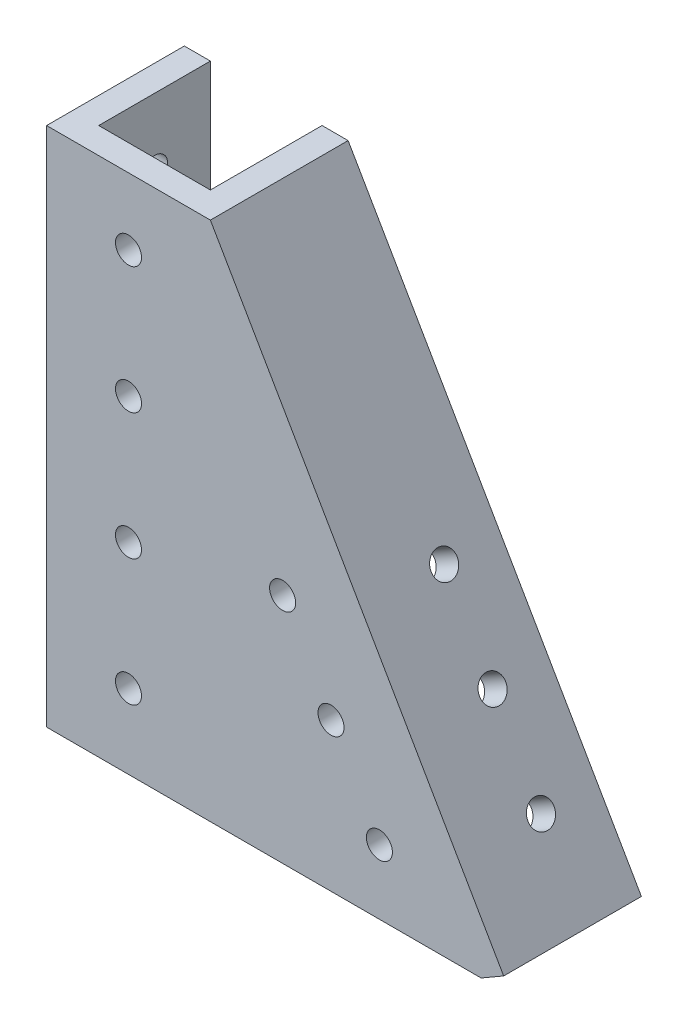
ISO-10303-21;
HEADER;
FILE_DESCRIPTION(('STEP AP214'),'2;1');
FILE_NAME('part.step','',(''),(''),'','','');
FILE_SCHEMA(('AUTOMOTIVE_DESIGN { 1 0 10303 214 1 1 1 1 }'));
ENDSEC;
DATA;
#1=APPLICATION_CONTEXT('core data for automotive mechanical design processes');
#2=APPLICATION_PROTOCOL_DEFINITION('international standard','automotive_design',2000,#1);
#3=PRODUCT_CONTEXT('',#1,'mechanical');
#4=PRODUCT('Part','Part','',(#3));
#5=PRODUCT_RELATED_PRODUCT_CATEGORY('part','',(#4));
#6=PRODUCT_DEFINITION_FORMATION('','',#4);
#7=PRODUCT_DEFINITION_CONTEXT('part definition',#1,'design');
#8=PRODUCT_DEFINITION('design','',#6,#7);
#9=PRODUCT_DEFINITION_SHAPE('','',#8);
#10=(LENGTH_UNIT() NAMED_UNIT(*) SI_UNIT(.MILLI.,.METRE.));
#11=(NAMED_UNIT(*) PLANE_ANGLE_UNIT() SI_UNIT($,.RADIAN.));
#12=(NAMED_UNIT(*) SI_UNIT($,.STERADIAN.) SOLID_ANGLE_UNIT());
#13=UNCERTAINTY_MEASURE_WITH_UNIT(LENGTH_MEASURE(1.E-05),#10,'distance_accuracy_value','');
#14=(GEOMETRIC_REPRESENTATION_CONTEXT(3) GLOBAL_UNCERTAINTY_ASSIGNED_CONTEXT((#13)) GLOBAL_UNIT_ASSIGNED_CONTEXT((#10,
#11,#12)) REPRESENTATION_CONTEXT('',''));
#15=CARTESIAN_POINT('',(0.,0.,0.));
#16=DIRECTION('',(0.,0.,1.));
#17=DIRECTION('',(1.,0.,0.));
#18=AXIS2_PLACEMENT_3D('',#15,#16,#17);
#19=CARTESIAN_POINT('',(0.,0.,18.5));
#20=DIRECTION('',(0.,0.,1.));
#21=DIRECTION('',(1.,0.,0.));
#22=AXIS2_PLACEMENT_3D('',#19,#20,#21);
#23=PLANE('',#22);
#24=DIRECTION('',(-0.866025403784438,-0.5,0.));
#25=VECTOR('',#24,1.);
#26=CARTESIAN_POINT('',(44.2169499401539,-32.5112050110695,18.5));
#27=LINE('',#26,#25);
#28=CARTESIAN_POINT('',(47.2480388533995,-30.7612050110695,18.5));
#29=VERTEX_POINT('',#28);
#30=CARTESIAN_POINT('',(44.2169499401539,-32.5112050110695,18.5));
#31=VERTEX_POINT('',#30);
#32=EDGE_CURVE('E133',#29,#31,#27,.T.);
#33=ORIENTED_EDGE('',*,*,#32,.F.);
#34=DIRECTION('',(-0.500000000000002,0.866025403784438,0.));
#35=VECTOR('',#34,1.);
#36=CARTESIAN_POINT('',(7.85498998013769,37.4695571024635,18.5));
#37=LINE('',#36,#35);
#38=CARTESIAN_POINT('',(7.85498998013769,37.4695571024635,18.5));
#39=VERTEX_POINT('',#38);
#40=EDGE_CURVE('E145',#29,#39,#37,.T.);
#41=ORIENTED_EDGE('',*,*,#40,.T.);
#42=DIRECTION('',(-1.,0.,0.));
#43=VECTOR('',#42,1.);
#44=CARTESIAN_POINT('',(-14.1450100198623,37.4695571024635,18.5));
#45=LINE('',#44,#43);
#46=CARTESIAN_POINT('',(-14.1450100198623,37.4695571024635,18.5));
#47=VERTEX_POINT('',#46);
#48=EDGE_CURVE('E153',#39,#47,#45,.T.);
#49=ORIENTED_EDGE('',*,*,#48,.T.);
#50=DIRECTION('',(0.,-1.,0.));
#51=VECTOR('',#50,1.);
#52=CARTESIAN_POINT('',(-14.1450100198623,37.4695571024635,18.5));
#53=LINE('',#52,#51);
#54=CARTESIAN_POINT('',(-14.1450100198623,-32.5112050110695,18.5));
#55=VERTEX_POINT('',#54);
#56=EDGE_CURVE('E157',#47,#55,#53,.T.);
#57=ORIENTED_EDGE('',*,*,#56,.T.);
#58=DIRECTION('',(1.,0.,0.));
#59=VECTOR('',#58,1.);
#60=CARTESIAN_POINT('',(-14.1450100198623,-32.5112050110695,18.5));
#61=LINE('',#60,#59);
#62=EDGE_CURVE('E148',#55,#31,#61,.T.);
#63=ORIENTED_EDGE('',*,*,#62,.T.);
#64=EDGE_LOOP('',(#33,#41,#49,#57,#63));
#65=FACE_BOUND('',#64,.T.);
#66=CARTESIAN_POINT('',(-3.14501001986231,-22.5112050110695,18.5));
#67=DIRECTION('',(0.,0.,-1.));
#68=DIRECTION('',(-1.,0.,0.));
#69=AXIS2_PLACEMENT_3D('',#66,#67,#68);
#70=CIRCLE('',#69,1.75);
#71=CARTESIAN_POINT('',(-4.89501001986231,-22.5112050110695,18.5));
#72=VERTEX_POINT('',#71);
#73=EDGE_CURVE('E202',#72,#72,#70,.T.);
#74=ORIENTED_EDGE('',*,*,#73,.T.);
#75=EDGE_LOOP('',(#74));
#76=FACE_BOUND('',#75,.T.);
#77=CARTESIAN_POINT('',(-3.14501001986231,-5.51120501106949,18.5));
#78=DIRECTION('',(0.,0.,-1.));
#79=DIRECTION('',(-1.,0.,0.));
#80=AXIS2_PLACEMENT_3D('',#77,#78,#79);
#81=CIRCLE('',#80,1.75);
#82=CARTESIAN_POINT('',(-4.89501001986232,-5.51120501106949,18.5));
#83=VERTEX_POINT('',#82);
#84=EDGE_CURVE('E194',#83,#83,#81,.T.);
#85=ORIENTED_EDGE('',*,*,#84,.T.);
#86=EDGE_LOOP('',(#85));
#87=FACE_BOUND('',#86,.T.);
#88=CARTESIAN_POINT('',(24.0566959023096,-12.5926207240274,18.5));
#89=DIRECTION('',(0.,0.,-1.));
#90=DIRECTION('',(-1.,0.,0.));
#91=AXIS2_PLACEMENT_3D('',#88,#89,#90);
#92=CIRCLE('',#91,1.75000000000002);
#93=CARTESIAN_POINT('',(22.3066959023095,-12.5926207240274,18.5));
#94=VERTEX_POINT('',#93);
#95=EDGE_CURVE('E186',#94,#94,#92,.T.);
#96=ORIENTED_EDGE('',*,*,#95,.T.);
#97=EDGE_LOOP('',(#96));
#98=FACE_BOUND('',#97,.T.);
#99=CARTESIAN_POINT('',(30.5566959023095,-23.8509509732251,18.5));
#100=DIRECTION('',(0.,0.,-1.));
#101=DIRECTION('',(-1.,0.,0.));
#102=AXIS2_PLACEMENT_3D('',#99,#100,#101);
#103=CIRCLE('',#102,1.75);
#104=CARTESIAN_POINT('',(28.8066959023095,-23.8509509732251,18.5));
#105=VERTEX_POINT('',#104);
#106=EDGE_CURVE('E182',#105,#105,#103,.T.);
#107=ORIENTED_EDGE('',*,*,#106,.T.);
#108=EDGE_LOOP('',(#107));
#109=FACE_BOUND('',#108,.T.);
#110=CARTESIAN_POINT('',(17.5566959023095,-1.3342904748297,18.5));
#111=DIRECTION('',(0.,0.,-1.));
#112=DIRECTION('',(-1.,0.,0.));
#113=AXIS2_PLACEMENT_3D('',#110,#111,#112);
#114=CIRCLE('',#113,1.75);
#115=CARTESIAN_POINT('',(15.8066959023095,-1.3342904748297,18.5));
#116=VERTEX_POINT('',#115);
#117=EDGE_CURVE('E190',#116,#116,#114,.T.);
#118=ORIENTED_EDGE('',*,*,#117,.T.);
#119=EDGE_LOOP('',(#118));
#120=FACE_BOUND('',#119,.T.);
#121=CARTESIAN_POINT('',(-3.14501001986232,11.4887949889305,18.5));
#122=DIRECTION('',(0.,0.,-1.));
#123=DIRECTION('',(-1.,0.,0.));
#124=AXIS2_PLACEMENT_3D('',#121,#122,#123);
#125=CIRCLE('',#124,1.75);
#126=CARTESIAN_POINT('',(-4.89501001986232,11.4887949889305,18.5));
#127=VERTEX_POINT('',#126);
#128=EDGE_CURVE('E198',#127,#127,#125,.T.);
#129=ORIENTED_EDGE('',*,*,#128,.T.);
#130=EDGE_LOOP('',(#129));
#131=FACE_BOUND('',#130,.T.);
#132=CARTESIAN_POINT('',(-3.14501001986232,28.4887949889305,18.5));
#133=DIRECTION('',(0.,0.,-1.));
#134=DIRECTION('',(-1.,0.,0.));
#135=AXIS2_PLACEMENT_3D('',#132,#133,#134);
#136=CIRCLE('',#135,1.75);
#137=CARTESIAN_POINT('',(-4.89501001986232,28.4887949889305,18.5));
#138=VERTEX_POINT('',#137);
#139=EDGE_CURVE('E206',#138,#138,#136,.T.);
#140=ORIENTED_EDGE('',*,*,#139,.T.);
#141=EDGE_LOOP('',(#140));
#142=FACE_BOUND('',#141,.T.);
#143=ADVANCED_FACE('F34',(#65,#76,#87,#98,#109,#120,#131,#142),#23,.T.);
#144=CARTESIAN_POINT('',(0.,0.,15.));
#145=DIRECTION('',(0.,0.,1.));
#146=DIRECTION('',(1.,0.,0.));
#147=AXIS2_PLACEMENT_3D('',#144,#145,#146);
#148=PLANE('',#147);
#149=CARTESIAN_POINT('',(-3.14501001986231,-22.5112050110695,15.));
#150=DIRECTION('',(0.,0.,1.));
#151=DIRECTION('',(1.,0.,0.));
#152=AXIS2_PLACEMENT_3D('',#149,#150,#151);
#153=CIRCLE('',#152,1.75);
#154=CARTESIAN_POINT('',(-1.39501001986231,-22.5112050110695,15.));
#155=VERTEX_POINT('',#154);
#156=EDGE_CURVE('E199',#155,#155,#153,.F.);
#157=ORIENTED_EDGE('',*,*,#156,.F.);
#158=EDGE_LOOP('',(#157));
#159=FACE_BOUND('',#158,.T.);
#160=CARTESIAN_POINT('',(-3.14501001986231,-5.51120501106949,15.));
#161=DIRECTION('',(0.,0.,1.));
#162=DIRECTION('',(1.,0.,0.));
#163=AXIS2_PLACEMENT_3D('',#160,#161,#162);
#164=CIRCLE('',#163,1.75);
#165=CARTESIAN_POINT('',(-1.39501001986231,-5.51120501106949,15.));
#166=VERTEX_POINT('',#165);
#167=EDGE_CURVE('E191',#166,#166,#164,.F.);
#168=ORIENTED_EDGE('',*,*,#167,.F.);
#169=EDGE_LOOP('',(#168));
#170=FACE_BOUND('',#169,.T.);
#171=DIRECTION('',(-1.,0.,0.));
#172=VECTOR('',#171,1.);
#173=CARTESIAN_POINT('',(-10.6450100198623,37.4695571024635,15.));
#174=LINE('',#173,#172);
#175=CARTESIAN_POINT('',(4.35498998013769,37.4695571024635,15.));
#176=VERTEX_POINT('',#175);
#177=CARTESIAN_POINT('',(-10.6450100198623,37.4695571024635,15.));
#178=VERTEX_POINT('',#177);
#179=EDGE_CURVE('E304',#176,#178,#174,.T.);
#180=ORIENTED_EDGE('',*,*,#179,.F.);
#181=DIRECTION('',(0.,1.,0.));
#182=VECTOR('',#181,1.);
#183=CARTESIAN_POINT('',(4.35498998013769,37.4695571024635,15.));
#184=LINE('',#183,#182);
#185=CARTESIAN_POINT('',(4.3549899801377,-32.5112050110695,15.));
#186=VERTEX_POINT('',#185);
#187=EDGE_CURVE('E165',#186,#176,#184,.T.);
#188=ORIENTED_EDGE('',*,*,#187,.F.);
#189=DIRECTION('',(1.,0.,0.));
#190=VECTOR('',#189,1.);
#191=CARTESIAN_POINT('',(-10.6450100198623,-32.5112050110695,15.));
#192=LINE('',#191,#190);
#193=CARTESIAN_POINT('',(-10.6450100198623,-32.5112050110695,15.));
#194=VERTEX_POINT('',#193);
#195=EDGE_CURVE('E298',#194,#186,#192,.T.);
#196=ORIENTED_EDGE('',*,*,#195,.F.);
#197=DIRECTION('',(0.,-1.,0.));
#198=VECTOR('',#197,1.);
#199=CARTESIAN_POINT('',(-10.6450100198623,37.4695571024635,15.));
#200=LINE('',#199,#198);
#201=EDGE_CURVE('E301',#178,#194,#200,.T.);
#202=ORIENTED_EDGE('',*,*,#201,.F.);
#203=EDGE_LOOP('',(#180,#188,#196,#202));
#204=FACE_BOUND('',#203,.T.);
#205=CARTESIAN_POINT('',(-3.14501001986232,11.4887949889305,15.));
#206=DIRECTION('',(0.,0.,1.));
#207=DIRECTION('',(1.,0.,0.));
#208=AXIS2_PLACEMENT_3D('',#205,#206,#207);
#209=CIRCLE('',#208,1.75);
#210=CARTESIAN_POINT('',(-1.39501001986231,11.4887949889305,15.));
#211=VERTEX_POINT('',#210);
#212=EDGE_CURVE('E195',#211,#211,#209,.F.);
#213=ORIENTED_EDGE('',*,*,#212,.F.);
#214=EDGE_LOOP('',(#213));
#215=FACE_BOUND('',#214,.T.);
#216=CARTESIAN_POINT('',(-3.14501001986232,28.4887949889305,15.));
#217=DIRECTION('',(0.,0.,1.));
#218=DIRECTION('',(1.,0.,0.));
#219=AXIS2_PLACEMENT_3D('',#216,#217,#218);
#220=CIRCLE('',#219,1.75);
#221=CARTESIAN_POINT('',(-1.39501001986232,28.4887949889305,15.));
#222=VERTEX_POINT('',#221);
#223=EDGE_CURVE('E203',#222,#222,#220,.F.);
#224=ORIENTED_EDGE('',*,*,#223,.F.);
#225=EDGE_LOOP('',(#224));
#226=FACE_BOUND('',#225,.T.);
#227=ADVANCED_FACE('F354',(#159,#170,#204,#215,#226),#148,.F.);
#228=CARTESIAN_POINT('',(0.,0.,15.));
#229=DIRECTION('',(0.,0.,1.));
#230=DIRECTION('',(1.,0.,0.));
#231=AXIS2_PLACEMENT_3D('',#228,#229,#230);
#232=PLANE('',#231);
#233=CARTESIAN_POINT('',(24.0566959023096,-12.5926207240274,15.));
#234=DIRECTION('',(0.,0.,1.));
#235=DIRECTION('',(1.,0.,0.));
#236=AXIS2_PLACEMENT_3D('',#233,#234,#235);
#237=CIRCLE('',#236,1.75000000000002);
#238=CARTESIAN_POINT('',(25.8066959023096,-12.5926207240274,15.));
#239=VERTEX_POINT('',#238);
#240=EDGE_CURVE('E183',#239,#239,#237,.F.);
#241=ORIENTED_EDGE('',*,*,#240,.F.);
#242=EDGE_LOOP('',(#241));
#243=FACE_BOUND('',#242,.T.);
#244=DIRECTION('',(0.500000000000001,-0.866025403784438,0.));
#245=VECTOR('',#244,1.);
#246=CARTESIAN_POINT('',(6.89644186446516,2.12981114030804,15.));
#247=LINE('',#246,#245);
#248=CARTESIAN_POINT('',(6.89644186446516,2.12981114030804,15.));
#249=VERTEX_POINT('',#248);
#250=CARTESIAN_POINT('',(26.8964418644652,-32.5112050110695,15.));
#251=VERTEX_POINT('',#250);
#252=EDGE_CURVE('E265',#249,#251,#247,.T.);
#253=ORIENTED_EDGE('',*,*,#252,.F.);
#254=DIRECTION('',(-0.866025403784439,-0.5,0.));
#255=VECTOR('',#254,1.);
#256=CARTESIAN_POINT('',(19.8868229212317,9.62981114030804,15.));
#257=LINE('',#256,#255);
#258=CARTESIAN_POINT('',(19.8868229212317,9.62981114030804,15.));
#259=VERTEX_POINT('',#258);
#260=EDGE_CURVE('E275',#259,#249,#257,.T.);
#261=ORIENTED_EDGE('',*,*,#260,.F.);
#262=DIRECTION('',(-0.5,0.866025403784439,0.));
#263=VECTOR('',#262,1.);
#264=CARTESIAN_POINT('',(44.2169499401539,-32.5112050110695,15.));
#265=LINE('',#264,#263);
#266=CARTESIAN_POINT('',(44.2169499401539,-32.5112050110695,15.));
#267=VERTEX_POINT('',#266);
#268=EDGE_CURVE('E279',#267,#259,#265,.T.);
#269=ORIENTED_EDGE('',*,*,#268,.F.);
#270=DIRECTION('',(1.,0.,0.));
#271=VECTOR('',#270,1.);
#272=CARTESIAN_POINT('',(26.8964418644652,-32.5112050110695,15.));
#273=LINE('',#272,#271);
#274=EDGE_CURVE('E282',#251,#267,#273,.T.);
#275=ORIENTED_EDGE('',*,*,#274,.F.);
#276=EDGE_LOOP('',(#253,#261,#269,#275));
#277=FACE_BOUND('',#276,.T.);
#278=CARTESIAN_POINT('',(30.5566959023095,-23.8509509732251,15.));
#279=DIRECTION('',(0.,0.,1.));
#280=DIRECTION('',(1.,0.,0.));
#281=AXIS2_PLACEMENT_3D('',#278,#279,#280);
#282=CIRCLE('',#281,1.75);
#283=CARTESIAN_POINT('',(32.3066959023095,-23.8509509732251,15.));
#284=VERTEX_POINT('',#283);
#285=EDGE_CURVE('E178',#284,#284,#282,.F.);
#286=ORIENTED_EDGE('',*,*,#285,.F.);
#287=EDGE_LOOP('',(#286));
#288=FACE_BOUND('',#287,.T.);
#289=CARTESIAN_POINT('',(17.5566959023095,-1.3342904748297,15.));
#290=DIRECTION('',(0.,0.,1.));
#291=DIRECTION('',(1.,0.,0.));
#292=AXIS2_PLACEMENT_3D('',#289,#290,#291);
#293=CIRCLE('',#292,1.75);
#294=CARTESIAN_POINT('',(19.3066959023095,-1.3342904748297,15.));
#295=VERTEX_POINT('',#294);
#296=EDGE_CURVE('E187',#295,#295,#293,.F.);
#297=ORIENTED_EDGE('',*,*,#296,.F.);
#298=EDGE_LOOP('',(#297));
#299=FACE_BOUND('',#298,.T.);
#300=ADVANCED_FACE('F359',(#243,#277,#288,#299),#232,.F.);
#301=CARTESIAN_POINT('',(48.2584018244813,-32.5112050110695,18.5));
#302=DIRECTION('',(0.,1.,0.));
#303=DIRECTION('',(-1.,0.,0.));
#304=AXIS2_PLACEMENT_3D('',#301,#302,#303);
#305=PLANE('',#304);
#306=ORIENTED_EDGE('',*,*,#274,.T.);
#307=DIRECTION('',(0.,0.,1.));
#308=VECTOR('',#307,1.);
#309=CARTESIAN_POINT('',(44.2169499401539,-32.5112050110695,-0.500000000000004));
#310=LINE('',#309,#308);
#311=EDGE_CURVE('E140',#267,#31,#310,.T.);
#312=ORIENTED_EDGE('',*,*,#311,.T.);
#313=ORIENTED_EDGE('',*,*,#62,.F.);
#314=DIRECTION('',(0.,0.,-1.));
#315=VECTOR('',#314,1.);
#316=CARTESIAN_POINT('',(-14.1450100198623,-32.5112050110695,18.5));
#317=LINE('',#316,#315);
#318=CARTESIAN_POINT('',(-14.1450100198623,-32.5112050110695,0.));
#319=VERTEX_POINT('',#318);
#320=EDGE_CURVE('E12',#55,#319,#317,.T.);
#321=ORIENTED_EDGE('',*,*,#320,.T.);
#322=DIRECTION('',(1.,0.,0.));
#323=VECTOR('',#322,1.);
#324=CARTESIAN_POINT('',(48.2584018244813,-32.5112050110695,0.));
#325=LINE('',#324,#323);
#326=CARTESIAN_POINT('',(-10.6450100198623,-32.5112050110695,0.));
#327=VERTEX_POINT('',#326);
#328=EDGE_CURVE('E166',#319,#327,#325,.T.);
#329=ORIENTED_EDGE('',*,*,#328,.T.);
#330=DIRECTION('',(0.,0.,-1.));
#331=VECTOR('',#330,1.);
#332=CARTESIAN_POINT('',(-10.6450100198623,-32.5112050110695,101.570294578064));
#333=LINE('',#332,#331);
#334=EDGE_CURVE('E296',#194,#327,#333,.T.);
#335=ORIENTED_EDGE('',*,*,#334,.F.);
#336=ORIENTED_EDGE('',*,*,#195,.T.);
#337=DIRECTION('',(0.,0.,-1.));
#338=VECTOR('',#337,1.);
#339=CARTESIAN_POINT('',(4.3549899801377,-32.5112050110695,101.570294578064));
#340=LINE('',#339,#338);
#341=CARTESIAN_POINT('',(4.3549899801377,-32.5112050110695,0.));
#342=VERTEX_POINT('',#341);
#343=EDGE_CURVE('E292',#186,#342,#340,.T.);
#344=ORIENTED_EDGE('',*,*,#343,.T.);
#345=CARTESIAN_POINT('',(26.8964418644652,-32.5112050110695,0.));
#346=VERTEX_POINT('',#345);
#347=EDGE_CURVE('E164',#342,#346,#325,.T.);
#348=ORIENTED_EDGE('',*,*,#347,.T.);
#349=DIRECTION('',(0.,0.,-1.));
#350=VECTOR('',#349,1.);
#351=CARTESIAN_POINT('',(26.8964418644652,-32.5112050110695,101.570294578064));
#352=LINE('',#351,#350);
#353=EDGE_CURVE('E51',#251,#346,#352,.T.);
#354=ORIENTED_EDGE('',*,*,#353,.F.);
#355=EDGE_LOOP('',(#306,#312,#313,#321,#329,#335,#336,#344,#348,#354));
#356=FACE_BOUND('',#355,.T.);
#357=ADVANCED_FACE('F318',(#356),#305,.F.);
#358=CARTESIAN_POINT('',(0.,0.,0.));
#359=DIRECTION('',(0.,0.,1.));
#360=DIRECTION('',(1.,0.,0.));
#361=AXIS2_PLACEMENT_3D('',#358,#359,#360);
#362=PLANE('',#361);
#363=DIRECTION('',(-0.500000000000002,0.866025403784438,0.));
#364=VECTOR('',#363,1.);
#365=CARTESIAN_POINT('',(7.85498998013769,37.4695571024635,0.));
#366=LINE('',#365,#364);
#367=CARTESIAN_POINT('',(47.2480388533995,-30.7612050110695,0.));
#368=VERTEX_POINT('',#367);
#369=CARTESIAN_POINT('',(7.85498998013769,37.4695571024635,0.));
#370=VERTEX_POINT('',#369);
#371=EDGE_CURVE('E169',#368,#370,#366,.T.);
#372=ORIENTED_EDGE('',*,*,#371,.F.);
#373=DIRECTION('',(-0.866025403784439,-0.5,0.));
#374=VECTOR('',#373,1.);
#375=CARTESIAN_POINT('',(25.1320022086536,-43.5299047213212,0.));
#376=LINE('',#375,#374);
#377=CARTESIAN_POINT('',(44.2169499401539,-32.5112050110695,0.));
#378=VERTEX_POINT('',#377);
#379=EDGE_CURVE('E136',#368,#378,#376,.T.);
#380=ORIENTED_EDGE('',*,*,#379,.T.);
#381=DIRECTION('',(-0.5,0.866025403784439,0.));
#382=VECTOR('',#381,1.);
#383=CARTESIAN_POINT('',(44.2169499401539,-32.5112050110695,0.));
#384=LINE('',#383,#382);
#385=CARTESIAN_POINT('',(19.8868229212317,9.62981114030804,0.));
#386=VERTEX_POINT('',#385);
#387=EDGE_CURVE('E271',#378,#386,#384,.T.);
#388=ORIENTED_EDGE('',*,*,#387,.T.);
#389=DIRECTION('',(-0.866025403784438,-0.5,0.));
#390=VECTOR('',#389,1.);
#391=CARTESIAN_POINT('',(19.8868229212317,9.62981114030804,0.));
#392=LINE('',#391,#390);
#393=CARTESIAN_POINT('',(6.89644186446516,2.12981114030804,0.));
#394=VERTEX_POINT('',#393);
#395=EDGE_CURVE('E267',#386,#394,#392,.T.);
#396=ORIENTED_EDGE('',*,*,#395,.T.);
#397=DIRECTION('',(0.5,-0.866025403784438,0.));
#398=VECTOR('',#397,1.);
#399=CARTESIAN_POINT('',(6.89644186446516,2.12981114030804,0.));
#400=LINE('',#399,#398);
#401=EDGE_CURVE('E263',#394,#346,#400,.T.);
#402=ORIENTED_EDGE('',*,*,#401,.T.);
#403=ORIENTED_EDGE('',*,*,#347,.F.);
#404=DIRECTION('',(0.,1.,0.));
#405=VECTOR('',#404,1.);
#406=CARTESIAN_POINT('',(4.35498998013769,37.4695571024635,0.));
#407=LINE('',#406,#405);
#408=CARTESIAN_POINT('',(4.35498998013769,37.4695571024635,0.));
#409=VERTEX_POINT('',#408);
#410=EDGE_CURVE('E290',#342,#409,#407,.T.);
#411=ORIENTED_EDGE('',*,*,#410,.T.);
#412=DIRECTION('',(-1.,0.,0.));
#413=VECTOR('',#412,1.);
#414=CARTESIAN_POINT('',(-14.1450100198623,37.4695571024635,0.));
#415=LINE('',#414,#413);
#416=EDGE_CURVE('E172',#370,#409,#415,.T.);
#417=ORIENTED_EDGE('',*,*,#416,.F.);
#418=EDGE_LOOP('',(#372,#380,#388,#396,#402,#403,#411,#417));
#419=FACE_BOUND('',#418,.T.);
#420=ADVANCED_FACE('F368',(#419),#362,.F.);
#421=CARTESIAN_POINT('',(-14.1450100198623,37.4695571024635,18.5));
#422=DIRECTION('',(0.,-1.,0.));
#423=DIRECTION('',(0.,0.,-1.));
#424=AXIS2_PLACEMENT_3D('',#421,#422,#423);
#425=PLANE('',#424);
#426=DIRECTION('',(0.,0.,-1.));
#427=VECTOR('',#426,1.);
#428=CARTESIAN_POINT('',(-10.6450100198623,37.4695571024635,101.570294578064));
#429=LINE('',#428,#427);
#430=CARTESIAN_POINT('',(-10.6450100198623,37.4695571024635,0.));
#431=VERTEX_POINT('',#430);
#432=EDGE_CURVE('E278',#178,#431,#429,.T.);
#433=ORIENTED_EDGE('',*,*,#432,.T.);
#434=CARTESIAN_POINT('',(-14.1450100198623,37.4695571024635,0.));
#435=VERTEX_POINT('',#434);
#436=EDGE_CURVE('E171',#431,#435,#415,.T.);
#437=ORIENTED_EDGE('',*,*,#436,.T.);
#438=DIRECTION('',(0.,0.,-1.));
#439=VECTOR('',#438,1.);
#440=CARTESIAN_POINT('',(-14.1450100198623,37.4695571024635,18.5));
#441=LINE('',#440,#439);
#442=EDGE_CURVE('E155',#47,#435,#441,.T.);
#443=ORIENTED_EDGE('',*,*,#442,.F.);
#444=ORIENTED_EDGE('',*,*,#48,.F.);
#445=DIRECTION('',(0.,0.,-1.));
#446=VECTOR('',#445,1.);
#447=CARTESIAN_POINT('',(7.85498998013769,37.4695571024635,18.5));
#448=LINE('',#447,#446);
#449=EDGE_CURVE('E43',#39,#370,#448,.T.);
#450=ORIENTED_EDGE('',*,*,#449,.T.);
#451=ORIENTED_EDGE('',*,*,#416,.T.);
#452=DIRECTION('',(0.,0.,-1.));
#453=VECTOR('',#452,1.);
#454=CARTESIAN_POINT('',(4.35498998013769,37.4695571024635,101.570294578064));
#455=LINE('',#454,#453);
#456=EDGE_CURVE('E59',#176,#409,#455,.T.);
#457=ORIENTED_EDGE('',*,*,#456,.F.);
#458=ORIENTED_EDGE('',*,*,#179,.T.);
#459=EDGE_LOOP('',(#433,#437,#443,#444,#450,#451,#457,#458));
#460=FACE_BOUND('',#459,.T.);
#461=ADVANCED_FACE('F366',(#460),#425,.F.);
#462=DIRECTION('',(0.,-1.,0.));
#463=VECTOR('',#462,1.);
#464=CARTESIAN_POINT('',(-10.6450100198623,37.4695571024635,0.));
#465=LINE('',#464,#463);
#466=EDGE_CURVE('E293',#431,#327,#465,.T.);
#467=ORIENTED_EDGE('',*,*,#466,.T.);
#468=ORIENTED_EDGE('',*,*,#328,.F.);
#469=DIRECTION('',(0.,-1.,0.));
#470=VECTOR('',#469,1.);
#471=CARTESIAN_POINT('',(-14.1450100198623,37.4695571024635,0.));
#472=LINE('',#471,#470);
#473=EDGE_CURVE('E161',#435,#319,#472,.T.);
#474=ORIENTED_EDGE('',*,*,#473,.F.);
#475=ORIENTED_EDGE('',*,*,#436,.F.);
#476=EDGE_LOOP('',(#467,#468,#474,#475));
#477=FACE_BOUND('',#476,.T.);
#478=ADVANCED_FACE('F331',(#477),#362,.F.);
#479=CARTESIAN_POINT('',(-14.1450100198623,37.4695571024635,18.5));
#480=DIRECTION('',(1.,0.,0.));
#481=DIRECTION('',(0.,1.,0.));
#482=AXIS2_PLACEMENT_3D('',#479,#480,#481);
#483=PLANE('',#482);
#484=CARTESIAN_POINT('',(-14.1450100198623,28.4887949889305,7.50000000000001));
#485=DIRECTION('',(-1.,0.,0.));
#486=DIRECTION('',(0.,-1.,0.));
#487=AXIS2_PLACEMENT_3D('',#484,#485,#486);
#488=CIRCLE('',#487,1.75);
#489=CARTESIAN_POINT('',(-14.1450100198623,26.7387949889305,7.50000000000001));
#490=VERTEX_POINT('',#489);
#491=EDGE_CURVE('E226',#490,#490,#488,.T.);
#492=ORIENTED_EDGE('',*,*,#491,.F.);
#493=EDGE_LOOP('',(#492));
#494=FACE_BOUND('',#493,.T.);
#495=CARTESIAN_POINT('',(-14.1450100198623,11.4887949889305,7.50000000000001));
#496=DIRECTION('',(-1.,0.,0.));
#497=DIRECTION('',(0.,-1.,0.));
#498=AXIS2_PLACEMENT_3D('',#495,#496,#497);
#499=CIRCLE('',#498,1.75);
#500=CARTESIAN_POINT('',(-14.1450100198623,9.73879498893051,7.50000000000001));
#501=VERTEX_POINT('',#500);
#502=EDGE_CURVE('E216',#501,#501,#499,.T.);
#503=ORIENTED_EDGE('',*,*,#502,.F.);
#504=EDGE_LOOP('',(#503));
#505=FACE_BOUND('',#504,.T.);
#506=CARTESIAN_POINT('',(-14.1450100198623,-5.51120501106949,7.50000000000001));
#507=DIRECTION('',(-1.,0.,0.));
#508=DIRECTION('',(0.,-1.,0.));
#509=AXIS2_PLACEMENT_3D('',#506,#507,#508);
#510=CIRCLE('',#509,1.75);
#511=CARTESIAN_POINT('',(-14.1450100198623,-7.26120501106949,7.50000000000001));
#512=VERTEX_POINT('',#511);
#513=EDGE_CURVE('E213',#512,#512,#510,.T.);
#514=ORIENTED_EDGE('',*,*,#513,.F.);
#515=EDGE_LOOP('',(#514));
#516=FACE_BOUND('',#515,.T.);
#517=CARTESIAN_POINT('',(-14.1450100198623,-22.5112050110695,7.50000000000001));
#518=DIRECTION('',(-1.,0.,0.));
#519=DIRECTION('',(0.,-1.,0.));
#520=AXIS2_PLACEMENT_3D('',#517,#518,#519);
#521=CIRCLE('',#520,1.75);
#522=CARTESIAN_POINT('',(-14.1450100198623,-24.2612050110695,7.50000000000001));
#523=VERTEX_POINT('',#522);
#524=EDGE_CURVE('E210',#523,#523,#521,.T.);
#525=ORIENTED_EDGE('',*,*,#524,.F.);
#526=EDGE_LOOP('',(#525));
#527=FACE_BOUND('',#526,.T.);
#528=ORIENTED_EDGE('',*,*,#473,.T.);
#529=ORIENTED_EDGE('',*,*,#320,.F.);
#530=ORIENTED_EDGE('',*,*,#56,.F.);
#531=ORIENTED_EDGE('',*,*,#442,.T.);
#532=EDGE_LOOP('',(#528,#529,#530,#531));
#533=FACE_BOUND('',#532,.T.);
#534=ADVANCED_FACE('F36',(#494,#505,#516,#527,#533),#483,.F.);
#535=CARTESIAN_POINT('',(7.85498998013769,37.4695571024635,18.5));
#536=DIRECTION('',(-0.866025403784438,-0.500000000000002,0.));
#537=DIRECTION('',(0.500000000000002,-0.866025403784438,0.));
#538=AXIS2_PLACEMENT_3D('',#535,#536,#537);
#539=PLANE('',#538);
#540=CARTESIAN_POINT('',(28.2584018244813,2.12981114030802,7.49999999999999));
#541=DIRECTION('',(0.866025403784438,0.500000000000002,0.));
#542=DIRECTION('',(-0.500000000000002,0.866025403784438,0.));
#543=AXIS2_PLACEMENT_3D('',#540,#541,#542);
#544=CIRCLE('',#543,1.75);
#545=CARTESIAN_POINT('',(27.3834018244813,3.64535559693079,7.49999999999999));
#546=VERTEX_POINT('',#545);
#547=EDGE_CURVE('E181',#546,#546,#544,.T.);
#548=ORIENTED_EDGE('',*,*,#547,.F.);
#549=EDGE_LOOP('',(#548));
#550=FACE_BOUND('',#549,.T.);
#551=CARTESIAN_POINT('',(34.7584018244813,-9.12851910888967,7.49999999999999));
#552=DIRECTION('',(0.866025403784438,0.500000000000002,0.));
#553=DIRECTION('',(-0.500000000000002,0.866025403784438,0.));
#554=AXIS2_PLACEMENT_3D('',#551,#552,#553);
#555=CIRCLE('',#554,1.75);
#556=CARTESIAN_POINT('',(33.8834018244813,-7.6129746522669,7.49999999999999));
#557=VERTEX_POINT('',#556);
#558=EDGE_CURVE('E249',#557,#557,#555,.T.);
#559=ORIENTED_EDGE('',*,*,#558,.F.);
#560=EDGE_LOOP('',(#559));
#561=FACE_BOUND('',#560,.T.);
#562=CARTESIAN_POINT('',(41.2584018244813,-20.3868493580874,7.49999999999999));
#563=DIRECTION('',(0.866025403784438,0.500000000000002,0.));
#564=DIRECTION('',(-0.500000000000002,0.866025403784438,0.));
#565=AXIS2_PLACEMENT_3D('',#562,#563,#564);
#566=CIRCLE('',#565,1.75);
#567=CARTESIAN_POINT('',(40.3834018244813,-18.8713049014646,7.49999999999999));
#568=VERTEX_POINT('',#567);
#569=EDGE_CURVE('E255',#568,#568,#566,.T.);
#570=ORIENTED_EDGE('',*,*,#569,.F.);
#571=EDGE_LOOP('',(#570));
#572=FACE_BOUND('',#571,.T.);
#573=ORIENTED_EDGE('',*,*,#40,.F.);
#574=DIRECTION('',(0.,0.,1.));
#575=VECTOR('',#574,1.);
#576=CARTESIAN_POINT('',(47.2480388533995,-30.7612050110695,-0.500000000000004));
#577=LINE('',#576,#575);
#578=EDGE_CURVE('E130',#368,#29,#577,.T.);
#579=ORIENTED_EDGE('',*,*,#578,.F.);
#580=ORIENTED_EDGE('',*,*,#371,.T.);
#581=ORIENTED_EDGE('',*,*,#449,.F.);
#582=EDGE_LOOP('',(#573,#579,#580,#581));
#583=FACE_BOUND('',#582,.T.);
#584=ADVANCED_FACE('F150',(#550,#561,#572,#583),#539,.F.);
#585=CARTESIAN_POINT('',(-10.6450100198623,37.4695571024635,101.570294578064));
#586=DIRECTION('',(1.,0.,0.));
#587=DIRECTION('',(0.,1.,0.));
#588=AXIS2_PLACEMENT_3D('',#585,#586,#587);
#589=PLANE('',#588);
#590=CARTESIAN_POINT('',(-10.6450100198623,28.4887949889305,7.50000000000001));
#591=DIRECTION('',(1.,0.,0.));
#592=DIRECTION('',(0.,1.,0.));
#593=AXIS2_PLACEMENT_3D('',#590,#591,#592);
#594=CIRCLE('',#593,1.75);
#595=CARTESIAN_POINT('',(-10.6450100198623,30.2387949889305,7.50000000000001));
#596=VERTEX_POINT('',#595);
#597=EDGE_CURVE('E38',#596,#596,#594,.T.);
#598=ORIENTED_EDGE('',*,*,#597,.F.);
#599=EDGE_LOOP('',(#598));
#600=FACE_BOUND('',#599,.T.);
#601=CARTESIAN_POINT('',(-10.6450100198623,11.4887949889305,7.50000000000001));
#602=DIRECTION('',(1.,0.,0.));
#603=DIRECTION('',(0.,1.,0.));
#604=AXIS2_PLACEMENT_3D('',#601,#602,#603);
#605=CIRCLE('',#604,1.75);
#606=CARTESIAN_POINT('',(-10.6450100198623,13.2387949889305,7.50000000000001));
#607=VERTEX_POINT('',#606);
#608=EDGE_CURVE('E214',#607,#607,#605,.T.);
#609=ORIENTED_EDGE('',*,*,#608,.F.);
#610=EDGE_LOOP('',(#609));
#611=FACE_BOUND('',#610,.T.);
#612=CARTESIAN_POINT('',(-10.6450100198623,-5.51120501106949,7.50000000000001));
#613=DIRECTION('',(1.,0.,0.));
#614=DIRECTION('',(0.,1.,0.));
#615=AXIS2_PLACEMENT_3D('',#612,#613,#614);
#616=CIRCLE('',#615,1.75);
#617=CARTESIAN_POINT('',(-10.6450100198623,-3.76120501106949,7.50000000000001));
#618=VERTEX_POINT('',#617);
#619=EDGE_CURVE('E211',#618,#618,#616,.T.);
#620=ORIENTED_EDGE('',*,*,#619,.F.);
#621=EDGE_LOOP('',(#620));
#622=FACE_BOUND('',#621,.T.);
#623=CARTESIAN_POINT('',(-10.6450100198623,-22.5112050110695,7.50000000000001));
#624=DIRECTION('',(1.,0.,0.));
#625=DIRECTION('',(0.,1.,0.));
#626=AXIS2_PLACEMENT_3D('',#623,#624,#625);
#627=CIRCLE('',#626,1.75);
#628=CARTESIAN_POINT('',(-10.6450100198623,-20.7612050110695,7.50000000000001));
#629=VERTEX_POINT('',#628);
#630=EDGE_CURVE('E207',#629,#629,#627,.T.);
#631=ORIENTED_EDGE('',*,*,#630,.F.);
#632=EDGE_LOOP('',(#631));
#633=FACE_BOUND('',#632,.T.);
#634=ORIENTED_EDGE('',*,*,#201,.T.);
#635=ORIENTED_EDGE('',*,*,#334,.T.);
#636=ORIENTED_EDGE('',*,*,#466,.F.);
#637=ORIENTED_EDGE('',*,*,#432,.F.);
#638=EDGE_LOOP('',(#634,#635,#636,#637));
#639=FACE_BOUND('',#638,.T.);
#640=ADVANCED_FACE('F373',(#600,#611,#622,#633,#639),#589,.T.);
#641=CARTESIAN_POINT('',(4.35498998013769,37.4695571024635,101.570294578064));
#642=DIRECTION('',(-1.,0.,0.));
#643=DIRECTION('',(0.,-1.,0.));
#644=AXIS2_PLACEMENT_3D('',#641,#642,#643);
#645=PLANE('',#644);
#646=ORIENTED_EDGE('',*,*,#187,.T.);
#647=ORIENTED_EDGE('',*,*,#456,.T.);
#648=ORIENTED_EDGE('',*,*,#410,.F.);
#649=ORIENTED_EDGE('',*,*,#343,.F.);
#650=EDGE_LOOP('',(#646,#647,#648,#649));
#651=FACE_BOUND('',#650,.T.);
#652=ADVANCED_FACE('F390',(#651),#645,.T.);
#653=CARTESIAN_POINT('',(44.2169499401539,-32.5112050110695,101.570294578064));
#654=DIRECTION('',(-0.866025403784439,-0.5,0.));
#655=DIRECTION('',(0.5,-0.866025403784439,0.));
#656=AXIS2_PLACEMENT_3D('',#653,#654,#655);
#657=PLANE('',#656);
#658=CARTESIAN_POINT('',(25.2273129112357,0.379811140308017,7.49999999999999));
#659=DIRECTION('',(0.866025403784438,0.500000000000002,0.));
#660=DIRECTION('',(-0.500000000000002,0.866025403784438,0.));
#661=AXIS2_PLACEMENT_3D('',#658,#659,#660);
#662=CIRCLE('',#661,1.75);
#663=CARTESIAN_POINT('',(24.3523129112357,1.89535559693078,7.49999999999999));
#664=VERTEX_POINT('',#663);
#665=EDGE_CURVE('E246',#664,#664,#662,.T.);
#666=ORIENTED_EDGE('',*,*,#665,.T.);
#667=EDGE_LOOP('',(#666));
#668=FACE_BOUND('',#667,.T.);
#669=CARTESIAN_POINT('',(31.7273129112358,-10.8785191088897,7.49999999999999));
#670=DIRECTION('',(0.866025403784438,0.500000000000002,0.));
#671=DIRECTION('',(-0.500000000000002,0.866025403784438,0.));
#672=AXIS2_PLACEMENT_3D('',#669,#670,#671);
#673=CIRCLE('',#672,1.75);
#674=CARTESIAN_POINT('',(30.8523129112358,-9.3629746522669,7.49999999999999));
#675=VERTEX_POINT('',#674);
#676=EDGE_CURVE('E252',#675,#675,#673,.T.);
#677=ORIENTED_EDGE('',*,*,#676,.T.);
#678=EDGE_LOOP('',(#677));
#679=FACE_BOUND('',#678,.T.);
#680=CARTESIAN_POINT('',(38.2273129112358,-22.1368493580874,7.49999999999999));
#681=DIRECTION('',(0.866025403784438,0.500000000000002,0.));
#682=DIRECTION('',(-0.500000000000002,0.866025403784438,0.));
#683=AXIS2_PLACEMENT_3D('',#680,#681,#682);
#684=CIRCLE('',#683,1.75);
#685=CARTESIAN_POINT('',(37.3523129112358,-20.6213049014646,7.49999999999999));
#686=VERTEX_POINT('',#685);
#687=EDGE_CURVE('E258',#686,#686,#684,.T.);
#688=ORIENTED_EDGE('',*,*,#687,.T.);
#689=EDGE_LOOP('',(#688));
#690=FACE_BOUND('',#689,.T.);
#691=ORIENTED_EDGE('',*,*,#268,.T.);
#692=DIRECTION('',(0.,0.,-1.));
#693=VECTOR('',#692,1.);
#694=CARTESIAN_POINT('',(19.8868229212317,9.62981114030804,101.570294578064));
#695=LINE('',#694,#693);
#696=EDGE_CURVE('E270',#259,#386,#695,.T.);
#697=ORIENTED_EDGE('',*,*,#696,.T.);
#698=ORIENTED_EDGE('',*,*,#387,.F.);
#699=DIRECTION('',(0.,0.,-1.));
#700=VECTOR('',#699,1.);
#701=CARTESIAN_POINT('',(44.2169499401539,-32.5112050110695,101.570294578064));
#702=LINE('',#701,#700);
#703=EDGE_CURVE('E274',#267,#378,#702,.T.);
#704=ORIENTED_EDGE('',*,*,#703,.F.);
#705=EDGE_LOOP('',(#691,#697,#698,#704));
#706=FACE_BOUND('',#705,.T.);
#707=ADVANCED_FACE('F388',(#668,#679,#690,#706),#657,.T.);
#708=CARTESIAN_POINT('',(19.8868229212317,9.62981114030804,101.570294578064));
#709=DIRECTION('',(0.5,-0.866025403784439,0.));
#710=DIRECTION('',(0.866025403784439,0.5,0.));
#711=AXIS2_PLACEMENT_3D('',#708,#709,#710);
#712=PLANE('',#711);
#713=ORIENTED_EDGE('',*,*,#260,.T.);
#714=DIRECTION('',(0.,0.,-1.));
#715=VECTOR('',#714,1.);
#716=CARTESIAN_POINT('',(6.89644186446516,2.12981114030804,101.570294578064));
#717=LINE('',#716,#715);
#718=EDGE_CURVE('E266',#249,#394,#717,.T.);
#719=ORIENTED_EDGE('',*,*,#718,.T.);
#720=ORIENTED_EDGE('',*,*,#395,.F.);
#721=ORIENTED_EDGE('',*,*,#696,.F.);
#722=EDGE_LOOP('',(#713,#719,#720,#721));
#723=FACE_BOUND('',#722,.T.);
#724=ADVANCED_FACE('F417',(#723),#712,.T.);
#725=CARTESIAN_POINT('',(6.89644186446516,2.12981114030804,101.570294578064));
#726=DIRECTION('',(0.866025403784438,0.5,0.));
#727=DIRECTION('',(-0.500000000000001,0.866025403784438,0.));
#728=AXIS2_PLACEMENT_3D('',#725,#726,#727);
#729=PLANE('',#728);
#730=ORIENTED_EDGE('',*,*,#252,.T.);
#731=ORIENTED_EDGE('',*,*,#353,.T.);
#732=ORIENTED_EDGE('',*,*,#401,.F.);
#733=ORIENTED_EDGE('',*,*,#718,.F.);
#734=EDGE_LOOP('',(#730,#731,#732,#733));
#735=FACE_BOUND('',#734,.T.);
#736=ADVANCED_FACE('F412',(#735),#729,.T.);
#737=CARTESIAN_POINT('',(38.2273129112358,-22.1368493580874,7.49999999999999));
#738=DIRECTION('',(0.866025403784438,0.500000000000002,0.));
#739=DIRECTION('',(-0.500000000000001,0.866025403784438,0.));
#740=AXIS2_PLACEMENT_3D('',#737,#738,#739);
#741=CYLINDRICAL_SURFACE('',#740,1.75);
#742=ORIENTED_EDGE('',*,*,#687,.F.);
#743=EDGE_LOOP('',(#742));
#744=FACE_BOUND('',#743,.T.);
#745=ORIENTED_EDGE('',*,*,#569,.T.);
#746=EDGE_LOOP('',(#745));
#747=FACE_BOUND('',#746,.T.);
#748=ADVANCED_FACE('F431',(#744,#747),#741,.F.);
#749=CARTESIAN_POINT('',(31.7273129112358,-10.8785191088897,7.49999999999999));
#750=DIRECTION('',(0.866025403784438,0.500000000000002,0.));
#751=DIRECTION('',(-0.500000000000001,0.866025403784438,0.));
#752=AXIS2_PLACEMENT_3D('',#749,#750,#751);
#753=CYLINDRICAL_SURFACE('',#752,1.75);
#754=ORIENTED_EDGE('',*,*,#676,.F.);
#755=EDGE_LOOP('',(#754));
#756=FACE_BOUND('',#755,.T.);
#757=ORIENTED_EDGE('',*,*,#558,.T.);
#758=EDGE_LOOP('',(#757));
#759=FACE_BOUND('',#758,.T.);
#760=ADVANCED_FACE('F434',(#756,#759),#753,.F.);
#761=CARTESIAN_POINT('',(25.2273129112357,0.379811140308017,7.49999999999999));
#762=DIRECTION('',(0.866025403784438,0.500000000000002,0.));
#763=DIRECTION('',(-0.500000000000001,0.866025403784438,0.));
#764=AXIS2_PLACEMENT_3D('',#761,#762,#763);
#765=CYLINDRICAL_SURFACE('',#764,1.75);
#766=ORIENTED_EDGE('',*,*,#665,.F.);
#767=EDGE_LOOP('',(#766));
#768=FACE_BOUND('',#767,.T.);
#769=ORIENTED_EDGE('',*,*,#547,.T.);
#770=EDGE_LOOP('',(#769));
#771=FACE_BOUND('',#770,.T.);
#772=ADVANCED_FACE('F442',(#768,#771),#765,.F.);
#773=CARTESIAN_POINT('',(30.5566959023095,-23.8509509732251,14.5));
#774=DIRECTION('',(0.,0.,1.));
#775=DIRECTION('',(1.,0.,0.));
#776=AXIS2_PLACEMENT_3D('',#773,#774,#775);
#777=CYLINDRICAL_SURFACE('',#776,1.75);
#778=ORIENTED_EDGE('',*,*,#106,.F.);
#779=EDGE_LOOP('',(#778));
#780=FACE_BOUND('',#779,.T.);
#781=ORIENTED_EDGE('',*,*,#285,.T.);
#782=EDGE_LOOP('',(#781));
#783=FACE_BOUND('',#782,.T.);
#784=ADVANCED_FACE('F449',(#780,#783),#777,.F.);
#785=CARTESIAN_POINT('',(24.0566959023096,-12.5926207240274,14.5));
#786=DIRECTION('',(0.,0.,1.));
#787=DIRECTION('',(1.,0.,0.));
#788=AXIS2_PLACEMENT_3D('',#785,#786,#787);
#789=CYLINDRICAL_SURFACE('',#788,1.75000000000002);
#790=ORIENTED_EDGE('',*,*,#95,.F.);
#791=EDGE_LOOP('',(#790));
#792=FACE_BOUND('',#791,.T.);
#793=ORIENTED_EDGE('',*,*,#240,.T.);
#794=EDGE_LOOP('',(#793));
#795=FACE_BOUND('',#794,.T.);
#796=ADVANCED_FACE('F453',(#792,#795),#789,.F.);
#797=CARTESIAN_POINT('',(17.5566959023095,-1.3342904748297,14.5));
#798=DIRECTION('',(0.,0.,1.));
#799=DIRECTION('',(1.,0.,0.));
#800=AXIS2_PLACEMENT_3D('',#797,#798,#799);
#801=CYLINDRICAL_SURFACE('',#800,1.75);
#802=ORIENTED_EDGE('',*,*,#117,.F.);
#803=EDGE_LOOP('',(#802));
#804=FACE_BOUND('',#803,.T.);
#805=ORIENTED_EDGE('',*,*,#296,.T.);
#806=EDGE_LOOP('',(#805));
#807=FACE_BOUND('',#806,.T.);
#808=ADVANCED_FACE('F457',(#804,#807),#801,.F.);
#809=CARTESIAN_POINT('',(-3.14501001986231,-5.51120501106949,14.5));
#810=DIRECTION('',(0.,0.,1.));
#811=DIRECTION('',(1.,0.,0.));
#812=AXIS2_PLACEMENT_3D('',#809,#810,#811);
#813=CYLINDRICAL_SURFACE('',#812,1.75);
#814=ORIENTED_EDGE('',*,*,#84,.F.);
#815=EDGE_LOOP('',(#814));
#816=FACE_BOUND('',#815,.T.);
#817=ORIENTED_EDGE('',*,*,#167,.T.);
#818=EDGE_LOOP('',(#817));
#819=FACE_BOUND('',#818,.T.);
#820=ADVANCED_FACE('F461',(#816,#819),#813,.F.);
#821=CARTESIAN_POINT('',(-3.14501001986232,11.4887949889305,14.5));
#822=DIRECTION('',(0.,0.,1.));
#823=DIRECTION('',(1.,0.,0.));
#824=AXIS2_PLACEMENT_3D('',#821,#822,#823);
#825=CYLINDRICAL_SURFACE('',#824,1.75);
#826=ORIENTED_EDGE('',*,*,#128,.F.);
#827=EDGE_LOOP('',(#826));
#828=FACE_BOUND('',#827,.T.);
#829=ORIENTED_EDGE('',*,*,#212,.T.);
#830=EDGE_LOOP('',(#829));
#831=FACE_BOUND('',#830,.T.);
#832=ADVANCED_FACE('F465',(#828,#831),#825,.F.);
#833=CARTESIAN_POINT('',(-3.14501001986231,-22.5112050110695,14.5));
#834=DIRECTION('',(0.,0.,1.));
#835=DIRECTION('',(1.,0.,0.));
#836=AXIS2_PLACEMENT_3D('',#833,#834,#835);
#837=CYLINDRICAL_SURFACE('',#836,1.75);
#838=ORIENTED_EDGE('',*,*,#73,.F.);
#839=EDGE_LOOP('',(#838));
#840=FACE_BOUND('',#839,.T.);
#841=ORIENTED_EDGE('',*,*,#156,.T.);
#842=EDGE_LOOP('',(#841));
#843=FACE_BOUND('',#842,.T.);
#844=ADVANCED_FACE('F350',(#840,#843),#837,.F.);
#845=CARTESIAN_POINT('',(-3.14501001986232,28.4887949889305,14.5));
#846=DIRECTION('',(0.,0.,1.));
#847=DIRECTION('',(1.,0.,0.));
#848=AXIS2_PLACEMENT_3D('',#845,#846,#847);
#849=CYLINDRICAL_SURFACE('',#848,1.75);
#850=ORIENTED_EDGE('',*,*,#139,.F.);
#851=EDGE_LOOP('',(#850));
#852=FACE_BOUND('',#851,.T.);
#853=ORIENTED_EDGE('',*,*,#223,.T.);
#854=EDGE_LOOP('',(#853));
#855=FACE_BOUND('',#854,.T.);
#856=ADVANCED_FACE('F340',(#852,#855),#849,.F.);
#857=CARTESIAN_POINT('',(-10.1450100198623,-22.5112050110695,7.50000000000001));
#858=DIRECTION('',(-1.,0.,0.));
#859=DIRECTION('',(0.,-1.,0.));
#860=AXIS2_PLACEMENT_3D('',#857,#858,#859);
#861=CYLINDRICAL_SURFACE('',#860,1.75);
#862=ORIENTED_EDGE('',*,*,#630,.T.);
#863=EDGE_LOOP('',(#862));
#864=FACE_BOUND('',#863,.T.);
#865=ORIENTED_EDGE('',*,*,#524,.T.);
#866=EDGE_LOOP('',(#865));
#867=FACE_BOUND('',#866,.T.);
#868=ADVANCED_FACE('F337',(#864,#867),#861,.F.);
#869=CARTESIAN_POINT('',(-10.1450100198623,-5.51120501106949,7.50000000000001));
#870=DIRECTION('',(-1.,0.,0.));
#871=DIRECTION('',(0.,-1.,0.));
#872=AXIS2_PLACEMENT_3D('',#869,#870,#871);
#873=CYLINDRICAL_SURFACE('',#872,1.75);
#874=ORIENTED_EDGE('',*,*,#619,.T.);
#875=EDGE_LOOP('',(#874));
#876=FACE_BOUND('',#875,.T.);
#877=ORIENTED_EDGE('',*,*,#513,.T.);
#878=EDGE_LOOP('',(#877));
#879=FACE_BOUND('',#878,.T.);
#880=ADVANCED_FACE('F339',(#876,#879),#873,.F.);
#881=CARTESIAN_POINT('',(-10.1450100198623,11.4887949889305,7.50000000000001));
#882=DIRECTION('',(-1.,0.,0.));
#883=DIRECTION('',(0.,-1.,0.));
#884=AXIS2_PLACEMENT_3D('',#881,#882,#883);
#885=CYLINDRICAL_SURFACE('',#884,1.75);
#886=ORIENTED_EDGE('',*,*,#608,.T.);
#887=EDGE_LOOP('',(#886));
#888=FACE_BOUND('',#887,.T.);
#889=ORIENTED_EDGE('',*,*,#502,.T.);
#890=EDGE_LOOP('',(#889));
#891=FACE_BOUND('',#890,.T.);
#892=ADVANCED_FACE('F347',(#888,#891),#885,.F.);
#893=CARTESIAN_POINT('',(-10.1450100198623,28.4887949889305,7.50000000000001));
#894=DIRECTION('',(-1.,0.,0.));
#895=DIRECTION('',(0.,-1.,0.));
#896=AXIS2_PLACEMENT_3D('',#893,#894,#895);
#897=CYLINDRICAL_SURFACE('',#896,1.75);
#898=ORIENTED_EDGE('',*,*,#597,.T.);
#899=EDGE_LOOP('',(#898));
#900=FACE_BOUND('',#899,.T.);
#901=ORIENTED_EDGE('',*,*,#491,.T.);
#902=EDGE_LOOP('',(#901));
#903=FACE_BOUND('',#902,.T.);
#904=ADVANCED_FACE('F327',(#900,#903),#897,.F.);
#905=CARTESIAN_POINT('',(44.2169499401539,-32.5112050110695,-0.500000000000004));
#906=DIRECTION('',(-0.5,0.866025403784438,0.));
#907=DIRECTION('',(-0.866025403784439,-0.5,0.));
#908=AXIS2_PLACEMENT_3D('',#905,#906,#907);
#909=PLANE('',#908);
#910=ORIENTED_EDGE('',*,*,#578,.T.);
#911=ORIENTED_EDGE('',*,*,#32,.T.);
#912=ORIENTED_EDGE('',*,*,#311,.F.);
#913=ORIENTED_EDGE('',*,*,#703,.T.);
#914=ORIENTED_EDGE('',*,*,#379,.F.);
#915=EDGE_LOOP('',(#910,#911,#912,#913,#914));
#916=FACE_BOUND('',#915,.T.);
#917=ADVANCED_FACE('F132',(#916),#909,.F.);
#918=CLOSED_SHELL('',(#143,#227,#300,#357,#420,#461,#478,#534,#584,#640,#652,#707,#724,#736,
#748,#760,#772,#784,#796,#808,#820,#832,#844,#856,#868,#880,#892,#904,#917));
#919=MANIFOLD_SOLID_BREP('B2',#918);
#920=ADVANCED_BREP_SHAPE_REPRESENTATION('',(#18,#919),#14);
#921=SHAPE_DEFINITION_REPRESENTATION(#9,#920);
ENDSEC;
END-ISO-10303-21;
